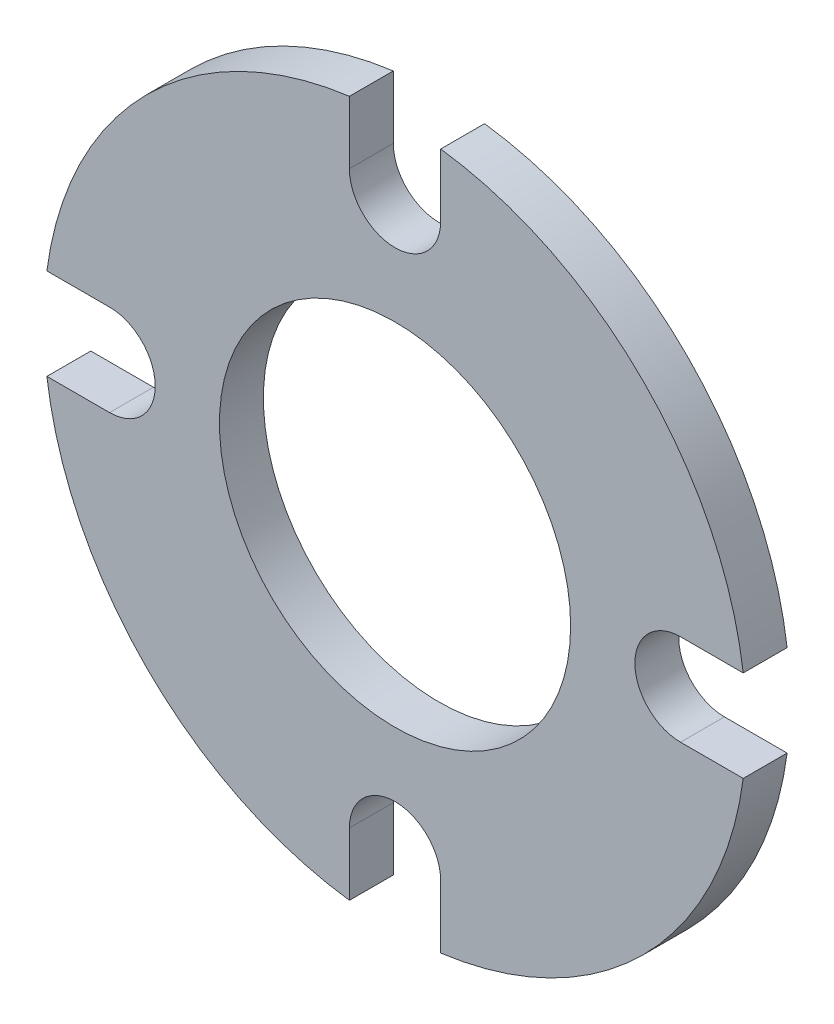
ISO-10303-21;
HEADER;
FILE_DESCRIPTION(('STEP AP214'),'2;1');
FILE_NAME('part.step','',(''),(''),'','','');
FILE_SCHEMA(('AUTOMOTIVE_DESIGN { 1 0 10303 214 1 1 1 1 }'));
ENDSEC;
DATA;
#1=APPLICATION_CONTEXT('core data for automotive mechanical design processes');
#2=APPLICATION_PROTOCOL_DEFINITION('international standard','automotive_design',2000,#1);
#3=PRODUCT_CONTEXT('',#1,'mechanical');
#4=PRODUCT('Part','Part','',(#3));
#5=PRODUCT_RELATED_PRODUCT_CATEGORY('part','',(#4));
#6=PRODUCT_DEFINITION_FORMATION('','',#4);
#7=PRODUCT_DEFINITION_CONTEXT('part definition',#1,'design');
#8=PRODUCT_DEFINITION('design','',#6,#7);
#9=PRODUCT_DEFINITION_SHAPE('','',#8);
#10=(LENGTH_UNIT() NAMED_UNIT(*) SI_UNIT(.MILLI.,.METRE.));
#11=(NAMED_UNIT(*) PLANE_ANGLE_UNIT() SI_UNIT($,.RADIAN.));
#12=(NAMED_UNIT(*) SI_UNIT($,.STERADIAN.) SOLID_ANGLE_UNIT());
#13=UNCERTAINTY_MEASURE_WITH_UNIT(LENGTH_MEASURE(1.E-05),#10,'distance_accuracy_value','');
#14=(GEOMETRIC_REPRESENTATION_CONTEXT(3) GLOBAL_UNCERTAINTY_ASSIGNED_CONTEXT((#13)) GLOBAL_UNIT_ASSIGNED_CONTEXT((#10,
#11,#12)) REPRESENTATION_CONTEXT('',''));
#15=CARTESIAN_POINT('',(0.,0.,0.));
#16=DIRECTION('',(0.,0.,1.));
#17=DIRECTION('',(1.,0.,0.));
#18=AXIS2_PLACEMENT_3D('',#15,#16,#17);
#19=CARTESIAN_POINT('',(0.,-0.13,0.0625));
#20=DIRECTION('',(0.,1.,0.));
#21=DIRECTION('',(0.,0.,1.));
#22=AXIS2_PLACEMENT_3D('',#19,#20,#21);
#23=PLANE('',#22);
#24=DIRECTION('',(1.,0.,0.));
#25=VECTOR('',#24,1.);
#26=CARTESIAN_POINT('',(0.,-0.13,-0.0625));
#27=LINE('',#26,#25);
#28=CARTESIAN_POINT('',(0.813,-0.13,-0.0625));
#29=VERTEX_POINT('',#28);
#30=CARTESIAN_POINT('',(0.991513993849809,-0.13,-0.0625));
#31=VERTEX_POINT('',#30);
#32=EDGE_CURVE('E182',#29,#31,#27,.T.);
#33=ORIENTED_EDGE('',*,*,#32,.F.);
#34=DIRECTION('',(0.,0.,-1.));
#35=VECTOR('',#34,1.);
#36=CARTESIAN_POINT('',(0.813,-0.13,0.0625));
#37=LINE('',#36,#35);
#38=CARTESIAN_POINT('',(0.813,-0.13,0.0625));
#39=VERTEX_POINT('',#38);
#40=EDGE_CURVE('E11',#39,#29,#37,.T.);
#41=ORIENTED_EDGE('',*,*,#40,.F.);
#42=DIRECTION('',(1.,0.,0.));
#43=VECTOR('',#42,1.);
#44=CARTESIAN_POINT('',(0.,-0.13,0.0625));
#45=LINE('',#44,#43);
#46=CARTESIAN_POINT('',(0.991513993849809,-0.13,0.0625));
#47=VERTEX_POINT('',#46);
#48=EDGE_CURVE('E315',#39,#47,#45,.T.);
#49=ORIENTED_EDGE('',*,*,#48,.T.);
#50=DIRECTION('',(0.,0.,-1.));
#51=VECTOR('',#50,1.);
#52=CARTESIAN_POINT('',(0.991513993849809,-0.13,0.0625));
#53=LINE('',#52,#51);
#54=EDGE_CURVE('E110',#47,#31,#53,.T.);
#55=ORIENTED_EDGE('',*,*,#54,.T.);
#56=EDGE_LOOP('',(#33,#41,#49,#55));
#57=FACE_BOUND('',#56,.T.);
#58=ADVANCED_FACE('F34',(#57),#23,.T.);
#59=CARTESIAN_POINT('',(0.813,0.,0.0625));
#60=DIRECTION('',(0.,0.,-1.));
#61=DIRECTION('',(-1.,0.,0.));
#62=AXIS2_PLACEMENT_3D('',#59,#60,#61);
#63=CYLINDRICAL_SURFACE('',#62,0.13);
#64=CARTESIAN_POINT('',(0.813,0.,-0.0625));
#65=DIRECTION('',(0.,0.,1.));
#66=DIRECTION('',(1.,0.,0.));
#67=AXIS2_PLACEMENT_3D('',#64,#65,#66);
#68=CIRCLE('',#67,0.13);
#69=CARTESIAN_POINT('',(0.813,0.13,-0.0625));
#70=VERTEX_POINT('',#69);
#71=EDGE_CURVE('E184',#29,#70,#68,.F.);
#72=ORIENTED_EDGE('',*,*,#71,.T.);
#73=DIRECTION('',(0.,0.,-1.));
#74=VECTOR('',#73,1.);
#75=CARTESIAN_POINT('',(0.813,0.13,0.0625));
#76=LINE('',#75,#74);
#77=CARTESIAN_POINT('',(0.813,0.13,0.0625));
#78=VERTEX_POINT('',#77);
#79=EDGE_CURVE('E43',#78,#70,#76,.T.);
#80=ORIENTED_EDGE('',*,*,#79,.F.);
#81=CARTESIAN_POINT('',(0.813,0.,0.0625));
#82=DIRECTION('',(0.,0.,1.));
#83=DIRECTION('',(1.,0.,0.));
#84=AXIS2_PLACEMENT_3D('',#81,#82,#83);
#85=CIRCLE('',#84,0.13);
#86=EDGE_CURVE('E317',#39,#78,#85,.F.);
#87=ORIENTED_EDGE('',*,*,#86,.F.);
#88=ORIENTED_EDGE('',*,*,#40,.T.);
#89=EDGE_LOOP('',(#72,#80,#87,#88));
#90=FACE_BOUND('',#89,.T.);
#91=ADVANCED_FACE('F255',(#90),#63,.F.);
#92=CARTESIAN_POINT('',(0.,0.13,0.0625));
#93=DIRECTION('',(0.,1.,0.));
#94=DIRECTION('',(0.,0.,1.));
#95=AXIS2_PLACEMENT_3D('',#92,#93,#94);
#96=PLANE('',#95);
#97=DIRECTION('',(1.,0.,0.));
#98=VECTOR('',#97,1.);
#99=CARTESIAN_POINT('',(0.,0.13,-0.0625));
#100=LINE('',#99,#98);
#101=CARTESIAN_POINT('',(0.991513993849809,0.13,-0.0625));
#102=VERTEX_POINT('',#101);
#103=EDGE_CURVE('E187',#70,#102,#100,.T.);
#104=ORIENTED_EDGE('',*,*,#103,.T.);
#105=DIRECTION('',(0.,0.,-1.));
#106=VECTOR('',#105,1.);
#107=CARTESIAN_POINT('',(0.991513993849809,0.13,0.0625));
#108=LINE('',#107,#106);
#109=CARTESIAN_POINT('',(0.991513993849809,0.13,0.0625));
#110=VERTEX_POINT('',#109);
#111=EDGE_CURVE('E243',#110,#102,#108,.T.);
#112=ORIENTED_EDGE('',*,*,#111,.F.);
#113=DIRECTION('',(1.,0.,0.));
#114=VECTOR('',#113,1.);
#115=CARTESIAN_POINT('',(0.,0.13,0.0625));
#116=LINE('',#115,#114);
#117=EDGE_CURVE('E251',#78,#110,#116,.T.);
#118=ORIENTED_EDGE('',*,*,#117,.F.);
#119=ORIENTED_EDGE('',*,*,#79,.T.);
#120=EDGE_LOOP('',(#104,#112,#118,#119));
#121=FACE_BOUND('',#120,.T.);
#122=ADVANCED_FACE('F248',(#121),#96,.F.);
#123=CARTESIAN_POINT('',(0.,0.,0.0625));
#124=DIRECTION('',(0.,0.,-1.));
#125=DIRECTION('',(-1.,0.,0.));
#126=AXIS2_PLACEMENT_3D('',#123,#124,#125);
#127=CYLINDRICAL_SURFACE('',#126,1.);
#128=CARTESIAN_POINT('',(0.,0.,-0.0625));
#129=DIRECTION('',(0.,0.,1.));
#130=DIRECTION('',(1.,0.,0.));
#131=AXIS2_PLACEMENT_3D('',#128,#129,#130);
#132=CIRCLE('',#131,1.);
#133=CARTESIAN_POINT('',(0.13,0.991513993849809,-0.0625));
#134=VERTEX_POINT('',#133);
#135=EDGE_CURVE('E190',#102,#134,#132,.T.);
#136=ORIENTED_EDGE('',*,*,#135,.T.);
#137=DIRECTION('',(0.,0.,-1.));
#138=VECTOR('',#137,1.);
#139=CARTESIAN_POINT('',(0.13,0.991513993849809,0.0625));
#140=LINE('',#139,#138);
#141=CARTESIAN_POINT('',(0.13,0.991513993849809,0.0625));
#142=VERTEX_POINT('',#141);
#143=EDGE_CURVE('E241',#142,#134,#140,.T.);
#144=ORIENTED_EDGE('',*,*,#143,.F.);
#145=CARTESIAN_POINT('',(0.,0.,0.0625));
#146=DIRECTION('',(0.,0.,1.));
#147=DIRECTION('',(1.,0.,0.));
#148=AXIS2_PLACEMENT_3D('',#145,#146,#147);
#149=CIRCLE('',#148,1.);
#150=EDGE_CURVE('E322',#110,#142,#149,.T.);
#151=ORIENTED_EDGE('',*,*,#150,.F.);
#152=ORIENTED_EDGE('',*,*,#111,.T.);
#153=EDGE_LOOP('',(#136,#144,#151,#152));
#154=FACE_BOUND('',#153,.T.);
#155=ADVANCED_FACE('F265',(#154),#127,.T.);
#156=CARTESIAN_POINT('',(0.13,0.,0.0625));
#157=DIRECTION('',(-1.,0.,0.));
#158=DIRECTION('',(0.,0.,1.));
#159=AXIS2_PLACEMENT_3D('',#156,#157,#158);
#160=PLANE('',#159);
#161=DIRECTION('',(0.,1.,0.));
#162=VECTOR('',#161,1.);
#163=CARTESIAN_POINT('',(0.13,0.,-0.0625));
#164=LINE('',#163,#162);
#165=CARTESIAN_POINT('',(0.13,0.813,-0.0625));
#166=VERTEX_POINT('',#165);
#167=EDGE_CURVE('E193',#166,#134,#164,.T.);
#168=ORIENTED_EDGE('',*,*,#167,.F.);
#169=DIRECTION('',(0.,0.,-1.));
#170=VECTOR('',#169,1.);
#171=CARTESIAN_POINT('',(0.13,0.813,0.0625));
#172=LINE('',#171,#170);
#173=CARTESIAN_POINT('',(0.13,0.813,0.0625));
#174=VERTEX_POINT('',#173);
#175=EDGE_CURVE('E239',#174,#166,#172,.T.);
#176=ORIENTED_EDGE('',*,*,#175,.F.);
#177=DIRECTION('',(0.,1.,0.));
#178=VECTOR('',#177,1.);
#179=CARTESIAN_POINT('',(0.13,0.,0.0625));
#180=LINE('',#179,#178);
#181=EDGE_CURVE('E324',#174,#142,#180,.T.);
#182=ORIENTED_EDGE('',*,*,#181,.T.);
#183=ORIENTED_EDGE('',*,*,#143,.T.);
#184=EDGE_LOOP('',(#168,#176,#182,#183));
#185=FACE_BOUND('',#184,.T.);
#186=ADVANCED_FACE('F266',(#185),#160,.T.);
#187=CARTESIAN_POINT('',(0.,0.813,0.0625));
#188=DIRECTION('',(0.,0.,-1.));
#189=DIRECTION('',(-1.,0.,0.));
#190=AXIS2_PLACEMENT_3D('',#187,#188,#189);
#191=CYLINDRICAL_SURFACE('',#190,0.13);
#192=CARTESIAN_POINT('',(0.,0.813,-0.0625));
#193=DIRECTION('',(0.,0.,1.));
#194=DIRECTION('',(1.,0.,0.));
#195=AXIS2_PLACEMENT_3D('',#192,#193,#194);
#196=CIRCLE('',#195,0.13);
#197=CARTESIAN_POINT('',(-0.13,0.813,-0.0625));
#198=VERTEX_POINT('',#197);
#199=EDGE_CURVE('E197',#166,#198,#196,.F.);
#200=ORIENTED_EDGE('',*,*,#199,.T.);
#201=DIRECTION('',(0.,0.,-1.));
#202=VECTOR('',#201,1.);
#203=CARTESIAN_POINT('',(-0.13,0.813,0.0625));
#204=LINE('',#203,#202);
#205=CARTESIAN_POINT('',(-0.13,0.813,0.0625));
#206=VERTEX_POINT('',#205);
#207=EDGE_CURVE('E236',#206,#198,#204,.T.);
#208=ORIENTED_EDGE('',*,*,#207,.F.);
#209=CARTESIAN_POINT('',(0.,0.813,0.0625));
#210=DIRECTION('',(0.,0.,1.));
#211=DIRECTION('',(1.,0.,0.));
#212=AXIS2_PLACEMENT_3D('',#209,#210,#211);
#213=CIRCLE('',#212,0.13);
#214=EDGE_CURVE('E328',#174,#206,#213,.F.);
#215=ORIENTED_EDGE('',*,*,#214,.F.);
#216=ORIENTED_EDGE('',*,*,#175,.T.);
#217=EDGE_LOOP('',(#200,#208,#215,#216));
#218=FACE_BOUND('',#217,.T.);
#219=ADVANCED_FACE('F269',(#218),#191,.F.);
#220=CARTESIAN_POINT('',(-0.13,0.,0.0625));
#221=DIRECTION('',(-1.,0.,0.));
#222=DIRECTION('',(0.,0.,1.));
#223=AXIS2_PLACEMENT_3D('',#220,#221,#222);
#224=PLANE('',#223);
#225=DIRECTION('',(0.,1.,0.));
#226=VECTOR('',#225,1.);
#227=CARTESIAN_POINT('',(-0.13,0.,-0.0625));
#228=LINE('',#227,#226);
#229=CARTESIAN_POINT('',(-0.13,0.991513993849809,-0.0625));
#230=VERTEX_POINT('',#229);
#231=EDGE_CURVE('E200',#198,#230,#228,.T.);
#232=ORIENTED_EDGE('',*,*,#231,.T.);
#233=DIRECTION('',(0.,0.,-1.));
#234=VECTOR('',#233,1.);
#235=CARTESIAN_POINT('',(-0.13,0.991513993849809,0.0625));
#236=LINE('',#235,#234);
#237=CARTESIAN_POINT('',(-0.13,0.991513993849809,0.0625));
#238=VERTEX_POINT('',#237);
#239=EDGE_CURVE('E233',#238,#230,#236,.T.);
#240=ORIENTED_EDGE('',*,*,#239,.F.);
#241=DIRECTION('',(0.,1.,0.));
#242=VECTOR('',#241,1.);
#243=CARTESIAN_POINT('',(-0.13,0.,0.0625));
#244=LINE('',#243,#242);
#245=EDGE_CURVE('E331',#206,#238,#244,.T.);
#246=ORIENTED_EDGE('',*,*,#245,.F.);
#247=ORIENTED_EDGE('',*,*,#207,.T.);
#248=EDGE_LOOP('',(#232,#240,#246,#247));
#249=FACE_BOUND('',#248,.T.);
#250=ADVANCED_FACE('F273',(#249),#224,.F.);
#251=CARTESIAN_POINT('',(-0.991513993849809,0.13,-0.0625));
#252=VERTEX_POINT('',#251);
#253=EDGE_CURVE('E194',#230,#252,#132,.T.);
#254=ORIENTED_EDGE('',*,*,#253,.T.);
#255=DIRECTION('',(0.,0.,-1.));
#256=VECTOR('',#255,1.);
#257=CARTESIAN_POINT('',(-0.991513993849809,0.13,0.0625));
#258=LINE('',#257,#256);
#259=CARTESIAN_POINT('',(-0.991513993849809,0.13,0.0625));
#260=VERTEX_POINT('',#259);
#261=EDGE_CURVE('E231',#260,#252,#258,.T.);
#262=ORIENTED_EDGE('',*,*,#261,.F.);
#263=EDGE_CURVE('E325',#238,#260,#149,.T.);
#264=ORIENTED_EDGE('',*,*,#263,.F.);
#265=ORIENTED_EDGE('',*,*,#239,.T.);
#266=EDGE_LOOP('',(#254,#262,#264,#265));
#267=FACE_BOUND('',#266,.T.);
#268=ADVANCED_FACE('F277',(#267),#127,.T.);
#269=CARTESIAN_POINT('',(0.,0.13,0.0625));
#270=DIRECTION('',(0.,-1.,0.));
#271=DIRECTION('',(0.,0.,-1.));
#272=AXIS2_PLACEMENT_3D('',#269,#270,#271);
#273=PLANE('',#272);
#274=DIRECTION('',(-1.,0.,0.));
#275=VECTOR('',#274,1.);
#276=CARTESIAN_POINT('',(0.,0.13,-0.0625));
#277=LINE('',#276,#275);
#278=CARTESIAN_POINT('',(-0.813,0.13,-0.0625));
#279=VERTEX_POINT('',#278);
#280=EDGE_CURVE('E203',#279,#252,#277,.T.);
#281=ORIENTED_EDGE('',*,*,#280,.F.);
#282=DIRECTION('',(0.,0.,-1.));
#283=VECTOR('',#282,1.);
#284=CARTESIAN_POINT('',(-0.813,0.13,0.0625));
#285=LINE('',#284,#283);
#286=CARTESIAN_POINT('',(-0.813,0.13,0.0625));
#287=VERTEX_POINT('',#286);
#288=EDGE_CURVE('E229',#287,#279,#285,.T.);
#289=ORIENTED_EDGE('',*,*,#288,.F.);
#290=DIRECTION('',(-1.,0.,0.));
#291=VECTOR('',#290,1.);
#292=CARTESIAN_POINT('',(0.,0.13,0.0625));
#293=LINE('',#292,#291);
#294=EDGE_CURVE('E334',#287,#260,#293,.T.);
#295=ORIENTED_EDGE('',*,*,#294,.T.);
#296=ORIENTED_EDGE('',*,*,#261,.T.);
#297=EDGE_LOOP('',(#281,#289,#295,#296));
#298=FACE_BOUND('',#297,.T.);
#299=ADVANCED_FACE('F279',(#298),#273,.T.);
#300=CARTESIAN_POINT('',(-0.813,0.,0.0625));
#301=DIRECTION('',(0.,0.,-1.));
#302=DIRECTION('',(-1.,0.,0.));
#303=AXIS2_PLACEMENT_3D('',#300,#301,#302);
#304=CYLINDRICAL_SURFACE('',#303,0.13);
#305=CARTESIAN_POINT('',(-0.813,0.,-0.0625));
#306=DIRECTION('',(0.,0.,1.));
#307=DIRECTION('',(1.,0.,0.));
#308=AXIS2_PLACEMENT_3D('',#305,#306,#307);
#309=CIRCLE('',#308,0.13);
#310=CARTESIAN_POINT('',(-0.813,-0.13,-0.0625));
#311=VERTEX_POINT('',#310);
#312=EDGE_CURVE('E206',#311,#279,#309,.T.);
#313=ORIENTED_EDGE('',*,*,#312,.F.);
#314=DIRECTION('',(0.,0.,-1.));
#315=VECTOR('',#314,1.);
#316=CARTESIAN_POINT('',(-0.813,-0.13,0.0625));
#317=LINE('',#316,#315);
#318=CARTESIAN_POINT('',(-0.813,-0.13,0.0625));
#319=VERTEX_POINT('',#318);
#320=EDGE_CURVE('E227',#319,#311,#317,.T.);
#321=ORIENTED_EDGE('',*,*,#320,.F.);
#322=CARTESIAN_POINT('',(-0.813,0.,0.0625));
#323=DIRECTION('',(0.,0.,1.));
#324=DIRECTION('',(1.,0.,0.));
#325=AXIS2_PLACEMENT_3D('',#322,#323,#324);
#326=CIRCLE('',#325,0.13);
#327=EDGE_CURVE('E337',#319,#287,#326,.T.);
#328=ORIENTED_EDGE('',*,*,#327,.T.);
#329=ORIENTED_EDGE('',*,*,#288,.T.);
#330=EDGE_LOOP('',(#313,#321,#328,#329));
#331=FACE_BOUND('',#330,.T.);
#332=ADVANCED_FACE('F282',(#331),#304,.F.);
#333=CARTESIAN_POINT('',(0.,-0.13,0.0625));
#334=DIRECTION('',(0.,-1.,0.));
#335=DIRECTION('',(0.,0.,-1.));
#336=AXIS2_PLACEMENT_3D('',#333,#334,#335);
#337=PLANE('',#336);
#338=DIRECTION('',(-1.,0.,0.));
#339=VECTOR('',#338,1.);
#340=CARTESIAN_POINT('',(0.,-0.13,-0.0625));
#341=LINE('',#340,#339);
#342=CARTESIAN_POINT('',(-0.991513993849809,-0.13,-0.0625));
#343=VERTEX_POINT('',#342);
#344=EDGE_CURVE('E209',#311,#343,#341,.T.);
#345=ORIENTED_EDGE('',*,*,#344,.T.);
#346=DIRECTION('',(0.,0.,-1.));
#347=VECTOR('',#346,1.);
#348=CARTESIAN_POINT('',(-0.991513993849809,-0.13,0.0625));
#349=LINE('',#348,#347);
#350=CARTESIAN_POINT('',(-0.991513993849809,-0.13,0.0625));
#351=VERTEX_POINT('',#350);
#352=EDGE_CURVE('E224',#351,#343,#349,.T.);
#353=ORIENTED_EDGE('',*,*,#352,.F.);
#354=DIRECTION('',(-1.,0.,0.));
#355=VECTOR('',#354,1.);
#356=CARTESIAN_POINT('',(0.,-0.13,0.0625));
#357=LINE('',#356,#355);
#358=EDGE_CURVE('E339',#319,#351,#357,.T.);
#359=ORIENTED_EDGE('',*,*,#358,.F.);
#360=ORIENTED_EDGE('',*,*,#320,.T.);
#361=EDGE_LOOP('',(#345,#353,#359,#360));
#362=FACE_BOUND('',#361,.T.);
#363=ADVANCED_FACE('F286',(#362),#337,.F.);
#364=CARTESIAN_POINT('',(-0.13,-0.991513993849809,-0.0625));
#365=VERTEX_POINT('',#364);
#366=EDGE_CURVE('E212',#343,#365,#132,.T.);
#367=ORIENTED_EDGE('',*,*,#366,.T.);
#368=DIRECTION('',(0.,0.,-1.));
#369=VECTOR('',#368,1.);
#370=CARTESIAN_POINT('',(-0.13,-0.991513993849809,0.0625));
#371=LINE('',#370,#369);
#372=CARTESIAN_POINT('',(-0.13,-0.991513993849809,0.0625));
#373=VERTEX_POINT('',#372);
#374=EDGE_CURVE('E222',#373,#365,#371,.T.);
#375=ORIENTED_EDGE('',*,*,#374,.F.);
#376=EDGE_CURVE('E175',#351,#373,#149,.T.);
#377=ORIENTED_EDGE('',*,*,#376,.F.);
#378=ORIENTED_EDGE('',*,*,#352,.T.);
#379=EDGE_LOOP('',(#367,#375,#377,#378));
#380=FACE_BOUND('',#379,.T.);
#381=ADVANCED_FACE('F290',(#380),#127,.T.);
#382=CARTESIAN_POINT('',(-0.13,0.,0.0625));
#383=DIRECTION('',(1.,0.,0.));
#384=DIRECTION('',(0.,0.,-1.));
#385=AXIS2_PLACEMENT_3D('',#382,#383,#384);
#386=PLANE('',#385);
#387=DIRECTION('',(0.,-1.,0.));
#388=VECTOR('',#387,1.);
#389=CARTESIAN_POINT('',(-0.13,0.,-0.0625));
#390=LINE('',#389,#388);
#391=CARTESIAN_POINT('',(-0.13,-0.813,-0.0625));
#392=VERTEX_POINT('',#391);
#393=EDGE_CURVE('E213',#392,#365,#390,.T.);
#394=ORIENTED_EDGE('',*,*,#393,.F.);
#395=DIRECTION('',(0.,0.,-1.));
#396=VECTOR('',#395,1.);
#397=CARTESIAN_POINT('',(-0.13,-0.813,0.0625));
#398=LINE('',#397,#396);
#399=CARTESIAN_POINT('',(-0.13,-0.813,0.0625));
#400=VERTEX_POINT('',#399);
#401=EDGE_CURVE('E163',#400,#392,#398,.T.);
#402=ORIENTED_EDGE('',*,*,#401,.F.);
#403=DIRECTION('',(0.,-1.,0.));
#404=VECTOR('',#403,1.);
#405=CARTESIAN_POINT('',(-0.13,0.,0.0625));
#406=LINE('',#405,#404);
#407=EDGE_CURVE('E173',#400,#373,#406,.T.);
#408=ORIENTED_EDGE('',*,*,#407,.T.);
#409=ORIENTED_EDGE('',*,*,#374,.T.);
#410=EDGE_LOOP('',(#394,#402,#408,#409));
#411=FACE_BOUND('',#410,.T.);
#412=ADVANCED_FACE('F292',(#411),#386,.T.);
#413=CARTESIAN_POINT('',(0.,-0.813,0.0625));
#414=DIRECTION('',(0.,0.,-1.));
#415=DIRECTION('',(-1.,0.,0.));
#416=AXIS2_PLACEMENT_3D('',#413,#414,#415);
#417=CYLINDRICAL_SURFACE('',#416,0.13);
#418=CARTESIAN_POINT('',(0.,-0.813,-0.0625));
#419=DIRECTION('',(0.,0.,1.));
#420=DIRECTION('',(1.,0.,0.));
#421=AXIS2_PLACEMENT_3D('',#418,#419,#420);
#422=CIRCLE('',#421,0.13);
#423=CARTESIAN_POINT('',(0.13,-0.813,-0.0625));
#424=VERTEX_POINT('',#423);
#425=EDGE_CURVE('E160',#424,#392,#422,.T.);
#426=ORIENTED_EDGE('',*,*,#425,.F.);
#427=DIRECTION('',(0.,0.,-1.));
#428=VECTOR('',#427,1.);
#429=CARTESIAN_POINT('',(0.13,-0.813,0.0625));
#430=LINE('',#429,#428);
#431=CARTESIAN_POINT('',(0.13,-0.813,0.0625));
#432=VERTEX_POINT('',#431);
#433=EDGE_CURVE('E154',#432,#424,#430,.T.);
#434=ORIENTED_EDGE('',*,*,#433,.F.);
#435=CARTESIAN_POINT('',(0.,-0.813,0.0625));
#436=DIRECTION('',(0.,0.,1.));
#437=DIRECTION('',(1.,0.,0.));
#438=AXIS2_PLACEMENT_3D('',#435,#436,#437);
#439=CIRCLE('',#438,0.13);
#440=EDGE_CURVE('E158',#432,#400,#439,.T.);
#441=ORIENTED_EDGE('',*,*,#440,.T.);
#442=ORIENTED_EDGE('',*,*,#401,.T.);
#443=EDGE_LOOP('',(#426,#434,#441,#442));
#444=FACE_BOUND('',#443,.T.);
#445=ADVANCED_FACE('F156',(#444),#417,.F.);
#446=CARTESIAN_POINT('',(0.13,0.,0.0625));
#447=DIRECTION('',(1.,0.,0.));
#448=DIRECTION('',(0.,0.,-1.));
#449=AXIS2_PLACEMENT_3D('',#446,#447,#448);
#450=PLANE('',#449);
#451=DIRECTION('',(0.,-1.,0.));
#452=VECTOR('',#451,1.);
#453=CARTESIAN_POINT('',(0.13,0.,-0.0625));
#454=LINE('',#453,#452);
#455=CARTESIAN_POINT('',(0.13,-0.991513993849809,-0.0625));
#456=VERTEX_POINT('',#455);
#457=EDGE_CURVE('E217',#424,#456,#454,.T.);
#458=ORIENTED_EDGE('',*,*,#457,.T.);
#459=DIRECTION('',(0.,0.,-1.));
#460=VECTOR('',#459,1.);
#461=CARTESIAN_POINT('',(0.13,-0.991513993849809,0.0625));
#462=LINE('',#461,#460);
#463=CARTESIAN_POINT('',(0.13,-0.991513993849809,0.0625));
#464=VERTEX_POINT('',#463);
#465=EDGE_CURVE('E164',#464,#456,#462,.T.);
#466=ORIENTED_EDGE('',*,*,#465,.F.);
#467=DIRECTION('',(0.,-1.,0.));
#468=VECTOR('',#467,1.);
#469=CARTESIAN_POINT('',(0.13,0.,0.0625));
#470=LINE('',#469,#468);
#471=EDGE_CURVE('E167',#432,#464,#470,.T.);
#472=ORIENTED_EDGE('',*,*,#471,.F.);
#473=ORIENTED_EDGE('',*,*,#433,.T.);
#474=EDGE_LOOP('',(#458,#466,#472,#473));
#475=FACE_BOUND('',#474,.T.);
#476=ADVANCED_FACE('F168',(#475),#450,.F.);
#477=CARTESIAN_POINT('',(0.,0.,0.0625));
#478=DIRECTION('',(0.,0.,-1.));
#479=DIRECTION('',(-1.,0.,0.));
#480=AXIS2_PLACEMENT_3D('',#477,#478,#479);
#481=CYLINDRICAL_SURFACE('',#480,0.5);
#482=CARTESIAN_POINT('',(0.,0.,0.0625));
#483=DIRECTION('',(0.,0.,1.));
#484=DIRECTION('',(1.,0.,0.));
#485=AXIS2_PLACEMENT_3D('',#482,#483,#484);
#486=CIRCLE('',#485,0.5);
#487=CARTESIAN_POINT('',(0.5,0.,0.0625));
#488=VERTEX_POINT('',#487);
#489=EDGE_CURVE('E313',#488,#488,#486,.T.);
#490=ORIENTED_EDGE('',*,*,#489,.T.);
#491=EDGE_LOOP('',(#490));
#492=FACE_BOUND('',#491,.T.);
#493=CARTESIAN_POINT('',(0.,0.,-0.0625));
#494=DIRECTION('',(0.,0.,1.));
#495=DIRECTION('',(1.,0.,0.));
#496=AXIS2_PLACEMENT_3D('',#493,#494,#495);
#497=CIRCLE('',#496,0.5);
#498=CARTESIAN_POINT('',(0.5,0.,-0.0625));
#499=VERTEX_POINT('',#498);
#500=EDGE_CURVE('E179',#499,#499,#497,.T.);
#501=ORIENTED_EDGE('',*,*,#500,.F.);
#502=EDGE_LOOP('',(#501));
#503=FACE_BOUND('',#502,.T.);
#504=ADVANCED_FACE('F36',(#492,#503),#481,.F.);
#505=EDGE_CURVE('E103',#456,#31,#132,.T.);
#506=ORIENTED_EDGE('',*,*,#505,.T.);
#507=ORIENTED_EDGE('',*,*,#54,.F.);
#508=EDGE_CURVE('E51',#464,#47,#149,.T.);
#509=ORIENTED_EDGE('',*,*,#508,.F.);
#510=ORIENTED_EDGE('',*,*,#465,.T.);
#511=EDGE_LOOP('',(#506,#507,#509,#510));
#512=FACE_BOUND('',#511,.T.);
#513=ADVANCED_FACE('F300',(#512),#127,.T.);
#514=CARTESIAN_POINT('',(0.,0.,0.0625));
#515=DIRECTION('',(0.,0.,1.));
#516=DIRECTION('',(1.,0.,0.));
#517=AXIS2_PLACEMENT_3D('',#514,#515,#516);
#518=PLANE('',#517);
#519=ORIENTED_EDGE('',*,*,#489,.F.);
#520=EDGE_LOOP('',(#519));
#521=FACE_BOUND('',#520,.T.);
#522=ORIENTED_EDGE('',*,*,#48,.F.);
#523=ORIENTED_EDGE('',*,*,#86,.T.);
#524=ORIENTED_EDGE('',*,*,#117,.T.);
#525=ORIENTED_EDGE('',*,*,#150,.T.);
#526=ORIENTED_EDGE('',*,*,#181,.F.);
#527=ORIENTED_EDGE('',*,*,#214,.T.);
#528=ORIENTED_EDGE('',*,*,#245,.T.);
#529=ORIENTED_EDGE('',*,*,#263,.T.);
#530=ORIENTED_EDGE('',*,*,#294,.F.);
#531=ORIENTED_EDGE('',*,*,#327,.F.);
#532=ORIENTED_EDGE('',*,*,#358,.T.);
#533=ORIENTED_EDGE('',*,*,#376,.T.);
#534=ORIENTED_EDGE('',*,*,#407,.F.);
#535=ORIENTED_EDGE('',*,*,#440,.F.);
#536=ORIENTED_EDGE('',*,*,#471,.T.);
#537=ORIENTED_EDGE('',*,*,#508,.T.);
#538=EDGE_LOOP('',(#522,#523,#524,#525,#526,#527,#528,#529,#530,#531,#532,#533,#534,#535,#536,#537));
#539=FACE_BOUND('',#538,.T.);
#540=ADVANCED_FACE('F171',(#521,#539),#518,.T.);
#541=CARTESIAN_POINT('',(0.,0.,-0.0625));
#542=DIRECTION('',(0.,0.,1.));
#543=DIRECTION('',(1.,0.,0.));
#544=AXIS2_PLACEMENT_3D('',#541,#542,#543);
#545=PLANE('',#544);
#546=ORIENTED_EDGE('',*,*,#500,.T.);
#547=EDGE_LOOP('',(#546));
#548=FACE_BOUND('',#547,.T.);
#549=ORIENTED_EDGE('',*,*,#32,.T.);
#550=ORIENTED_EDGE('',*,*,#505,.F.);
#551=ORIENTED_EDGE('',*,*,#457,.F.);
#552=ORIENTED_EDGE('',*,*,#425,.T.);
#553=ORIENTED_EDGE('',*,*,#393,.T.);
#554=ORIENTED_EDGE('',*,*,#366,.F.);
#555=ORIENTED_EDGE('',*,*,#344,.F.);
#556=ORIENTED_EDGE('',*,*,#312,.T.);
#557=ORIENTED_EDGE('',*,*,#280,.T.);
#558=ORIENTED_EDGE('',*,*,#253,.F.);
#559=ORIENTED_EDGE('',*,*,#231,.F.);
#560=ORIENTED_EDGE('',*,*,#199,.F.);
#561=ORIENTED_EDGE('',*,*,#167,.T.);
#562=ORIENTED_EDGE('',*,*,#135,.F.);
#563=ORIENTED_EDGE('',*,*,#103,.F.);
#564=ORIENTED_EDGE('',*,*,#71,.F.);
#565=EDGE_LOOP('',(#549,#550,#551,#552,#553,#554,#555,#556,#557,#558,#559,#560,#561,#562,#563,#564));
#566=FACE_BOUND('',#565,.T.);
#567=ADVANCED_FACE('F256',(#548,#566),#545,.F.);
#568=CLOSED_SHELL('',(#58,#91,#122,#155,#186,#219,#250,#268,#299,#332,#363,#381,#412,#445,#476,
#504,#513,#540,#567));
#569=MANIFOLD_SOLID_BREP('B2',#568);
#570=ADVANCED_BREP_SHAPE_REPRESENTATION('',(#18,#569),#14);
#571=SHAPE_DEFINITION_REPRESENTATION(#9,#570);
ENDSEC;
END-ISO-10303-21;
